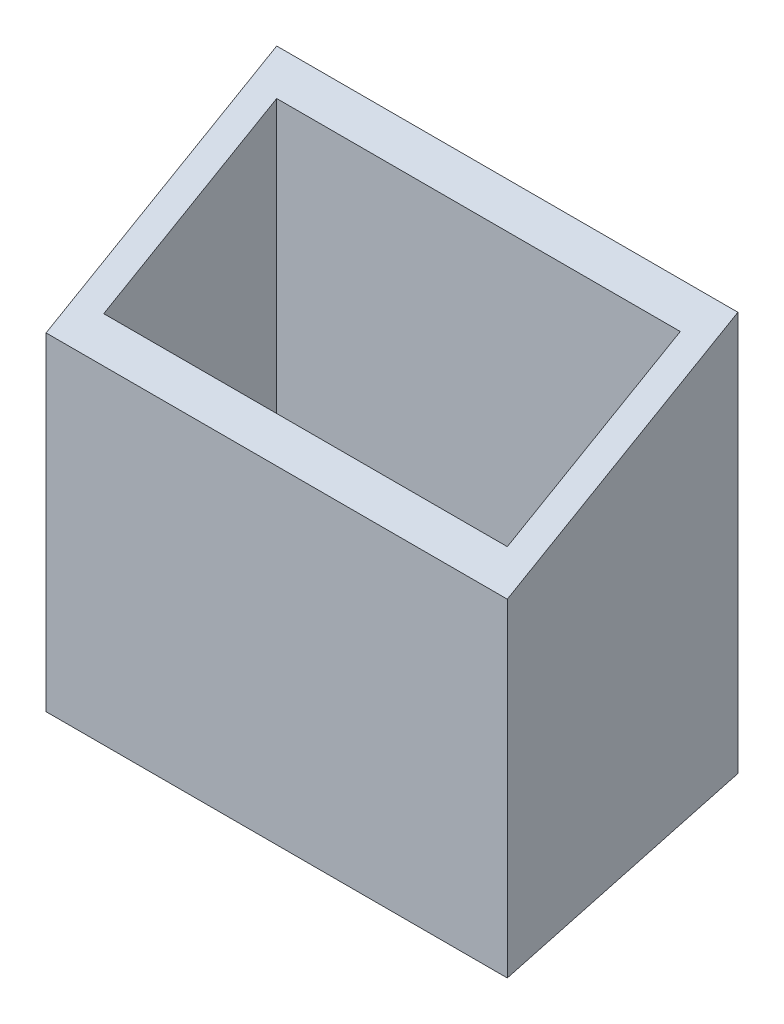
ISO-10303-21;
HEADER;
FILE_DESCRIPTION(('STEP AP214'),'2;1');
FILE_NAME('part.step','',(''),(''),'','','');
FILE_SCHEMA(('AUTOMOTIVE_DESIGN { 1 0 10303 214 1 1 1 1 }'));
ENDSEC;
DATA;
#1=APPLICATION_CONTEXT('core data for automotive mechanical design processes');
#2=APPLICATION_PROTOCOL_DEFINITION('international standard','automotive_design',2000,#1);
#3=PRODUCT_CONTEXT('',#1,'mechanical');
#4=PRODUCT('Part','Part','',(#3));
#5=PRODUCT_RELATED_PRODUCT_CATEGORY('part','',(#4));
#6=PRODUCT_DEFINITION_FORMATION('','',#4);
#7=PRODUCT_DEFINITION_CONTEXT('part definition',#1,'design');
#8=PRODUCT_DEFINITION('design','',#6,#7);
#9=PRODUCT_DEFINITION_SHAPE('','',#8);
#10=(LENGTH_UNIT() NAMED_UNIT(*) SI_UNIT(.MILLI.,.METRE.));
#11=(NAMED_UNIT(*) PLANE_ANGLE_UNIT() SI_UNIT($,.RADIAN.));
#12=(NAMED_UNIT(*) SI_UNIT($,.STERADIAN.) SOLID_ANGLE_UNIT());
#13=UNCERTAINTY_MEASURE_WITH_UNIT(LENGTH_MEASURE(1.E-05),#10,'distance_accuracy_value','');
#14=(GEOMETRIC_REPRESENTATION_CONTEXT(3) GLOBAL_UNCERTAINTY_ASSIGNED_CONTEXT((#13)) GLOBAL_UNIT_ASSIGNED_CONTEXT((#10,
#11,#12)) REPRESENTATION_CONTEXT('',''));
#15=CARTESIAN_POINT('',(0.,0.,0.));
#16=DIRECTION('',(0.,0.,1.));
#17=DIRECTION('',(1.,0.,0.));
#18=AXIS2_PLACEMENT_3D('',#15,#16,#17);
#19=CARTESIAN_POINT('',(25.4,50.8,-12.7));
#20=DIRECTION('',(-1.,0.,0.));
#21=DIRECTION('',(0.,0.,1.));
#22=AXIS2_PLACEMENT_3D('',#19,#20,#21);
#23=PLANE('',#22);
#24=DIRECTION('',(0.,0.258819045102522,-0.965925826289068));
#25=VECTOR('',#24,1.);
#26=CARTESIAN_POINT('',(25.4,3.17500000000001,0.850738685968815));
#27=LINE('',#26,#25);
#28=CARTESIAN_POINT('',(25.4,0.,12.7));
#29=VERTEX_POINT('',#28);
#30=CARTESIAN_POINT('',(25.4,6.80590948775054,-12.7));
#31=VERTEX_POINT('',#30);
#32=EDGE_CURVE('E116',#29,#31,#27,.T.);
#33=ORIENTED_EDGE('',*,*,#32,.T.);
#34=DIRECTION('',(0.,-1.,0.));
#35=VECTOR('',#34,1.);
#36=CARTESIAN_POINT('',(25.4,50.8,-12.7));
#37=LINE('',#36,#35);
#38=CARTESIAN_POINT('',(25.4,50.8,-12.7));
#39=VERTEX_POINT('',#38);
#40=EDGE_CURVE('E138',#39,#31,#37,.T.);
#41=ORIENTED_EDGE('',*,*,#40,.F.);
#42=DIRECTION('',(0.,-0.499999999999995,0.866025403784442));
#43=VECTOR('',#42,1.);
#44=CARTESIAN_POINT('',(25.4,32.6007386859691,18.8220452561247));
#45=LINE('',#44,#43);
#46=CARTESIAN_POINT('',(25.4,36.1353031625837,12.7));
#47=VERTEX_POINT('',#46);
#48=EDGE_CURVE('E183',#39,#47,#45,.T.);
#49=ORIENTED_EDGE('',*,*,#48,.T.);
#50=DIRECTION('',(0.,-1.,0.));
#51=VECTOR('',#50,1.);
#52=CARTESIAN_POINT('',(25.4,50.8,12.7));
#53=LINE('',#52,#51);
#54=EDGE_CURVE('E136',#47,#29,#53,.T.);
#55=ORIENTED_EDGE('',*,*,#54,.T.);
#56=EDGE_LOOP('',(#33,#41,#49,#55));
#57=FACE_BOUND('',#56,.T.);
#58=ADVANCED_FACE('F39',(#57),#23,.F.);
#59=CARTESIAN_POINT('',(-25.4,50.8,-12.7));
#60=DIRECTION('',(0.,0.,1.));
#61=DIRECTION('',(1.,0.,0.));
#62=AXIS2_PLACEMENT_3D('',#59,#60,#61);
#63=PLANE('',#62);
#64=DIRECTION('',(1.,0.,0.));
#65=VECTOR('',#64,1.);
#66=CARTESIAN_POINT('',(-25.4,6.80590948775054,-12.7));
#67=LINE('',#66,#65);
#68=CARTESIAN_POINT('',(-25.4,6.80590948775054,-12.7));
#69=VERTEX_POINT('',#68);
#70=EDGE_CURVE('E132',#69,#31,#67,.T.);
#71=ORIENTED_EDGE('',*,*,#70,.F.);
#72=DIRECTION('',(0.,-1.,0.));
#73=VECTOR('',#72,1.);
#74=CARTESIAN_POINT('',(-25.4,50.8,-12.7));
#75=LINE('',#74,#73);
#76=CARTESIAN_POINT('',(-25.4,50.8,-12.7));
#77=VERTEX_POINT('',#76);
#78=EDGE_CURVE('E131',#77,#69,#75,.T.);
#79=ORIENTED_EDGE('',*,*,#78,.F.);
#80=DIRECTION('',(-1.,0.,0.));
#81=VECTOR('',#80,1.);
#82=CARTESIAN_POINT('',(-25.4,50.8,-12.7));
#83=LINE('',#82,#81);
#84=EDGE_CURVE('E122',#39,#77,#83,.T.);
#85=ORIENTED_EDGE('',*,*,#84,.F.);
#86=ORIENTED_EDGE('',*,*,#40,.T.);
#87=EDGE_LOOP('',(#71,#79,#85,#86));
#88=FACE_BOUND('',#87,.T.);
#89=ADVANCED_FACE('F188',(#88),#63,.F.);
#90=CARTESIAN_POINT('',(-25.4,50.8,-12.7));
#91=DIRECTION('',(1.,0.,0.));
#92=DIRECTION('',(0.,0.,-1.));
#93=AXIS2_PLACEMENT_3D('',#90,#91,#92);
#94=PLANE('',#93);
#95=DIRECTION('',(0.,0.258819045102522,-0.965925826289068));
#96=VECTOR('',#95,1.);
#97=CARTESIAN_POINT('',(-25.4,3.17500000000001,0.850738685968829));
#98=LINE('',#97,#96);
#99=CARTESIAN_POINT('',(-25.4,0.,12.7));
#100=VERTEX_POINT('',#99);
#101=EDGE_CURVE('E113',#100,#69,#98,.T.);
#102=ORIENTED_EDGE('',*,*,#101,.F.);
#103=DIRECTION('',(0.,-1.,0.));
#104=VECTOR('',#103,1.);
#105=CARTESIAN_POINT('',(-25.4,50.8,12.7));
#106=LINE('',#105,#104);
#107=CARTESIAN_POINT('',(-25.4,36.1353031625837,12.7));
#108=VERTEX_POINT('',#107);
#109=EDGE_CURVE('E129',#108,#100,#106,.T.);
#110=ORIENTED_EDGE('',*,*,#109,.F.);
#111=DIRECTION('',(0.,-0.499999999999995,0.866025403784442));
#112=VECTOR('',#111,1.);
#113=CARTESIAN_POINT('',(-25.4,32.6007386859691,18.8220452561247));
#114=LINE('',#113,#112);
#115=EDGE_CURVE('E64',#77,#108,#114,.T.);
#116=ORIENTED_EDGE('',*,*,#115,.F.);
#117=ORIENTED_EDGE('',*,*,#78,.T.);
#118=EDGE_LOOP('',(#102,#110,#116,#117));
#119=FACE_BOUND('',#118,.T.);
#120=ADVANCED_FACE('F128',(#119),#94,.F.);
#121=CARTESIAN_POINT('',(-22.225,50.8,-9.525));
#122=DIRECTION('',(1.,0.,0.));
#123=DIRECTION('',(0.,0.,-1.));
#124=AXIS2_PLACEMENT_3D('',#121,#122,#123);
#125=PLANE('',#124);
#126=DIRECTION('',(0.,-1.,0.));
#127=VECTOR('',#126,1.);
#128=CARTESIAN_POINT('',(-22.225,50.8,9.525));
#129=LINE('',#128,#127);
#130=CARTESIAN_POINT('',(-22.225,37.9683902672608,9.525));
#131=VERTEX_POINT('',#130);
#132=CARTESIAN_POINT('',(-22.225,0.85073868596882,9.525));
#133=VERTEX_POINT('',#132);
#134=EDGE_CURVE('E123',#131,#133,#129,.T.);
#135=ORIENTED_EDGE('',*,*,#134,.T.);
#136=DIRECTION('',(0.,0.258819045102522,-0.965925826289068));
#137=VECTOR('',#136,1.);
#138=CARTESIAN_POINT('',(-22.225,8.9592047438753,-20.7362072995546));
#139=LINE('',#138,#137);
#140=CARTESIAN_POINT('',(-22.225,5.95517080178173,-9.525));
#141=VERTEX_POINT('',#140);
#142=EDGE_CURVE('E186',#133,#141,#139,.T.);
#143=ORIENTED_EDGE('',*,*,#142,.T.);
#144=DIRECTION('',(0.,-1.,0.));
#145=VECTOR('',#144,1.);
#146=CARTESIAN_POINT('',(-22.225,50.8,-9.525));
#147=LINE('',#146,#145);
#148=CARTESIAN_POINT('',(-22.225,48.966912895323,-9.525));
#149=VERTEX_POINT('',#148);
#150=EDGE_CURVE('E171',#149,#141,#147,.T.);
#151=ORIENTED_EDGE('',*,*,#150,.F.);
#152=DIRECTION('',(0.,0.499999999999995,-0.866025403784442));
#153=VECTOR('',#152,1.);
#154=CARTESIAN_POINT('',(-22.225,49.4251846714922,-10.31875));
#155=LINE('',#154,#153);
#156=EDGE_CURVE('E155',#131,#149,#155,.T.);
#157=ORIENTED_EDGE('',*,*,#156,.F.);
#158=EDGE_LOOP('',(#135,#143,#151,#157));
#159=FACE_BOUND('',#158,.T.);
#160=ADVANCED_FACE('F209',(#159),#125,.T.);
#161=CARTESIAN_POINT('',(-22.225,50.8,9.525));
#162=DIRECTION('',(0.,0.,-1.));
#163=DIRECTION('',(-1.,0.,0.));
#164=AXIS2_PLACEMENT_3D('',#161,#162,#163);
#165=PLANE('',#164);
#166=DIRECTION('',(0.,-1.,0.));
#167=VECTOR('',#166,1.);
#168=CARTESIAN_POINT('',(22.225,50.8,9.525));
#169=LINE('',#168,#167);
#170=CARTESIAN_POINT('',(22.225,37.9683902672608,9.525));
#171=VERTEX_POINT('',#170);
#172=CARTESIAN_POINT('',(22.225,0.85073868596882,9.525));
#173=VERTEX_POINT('',#172);
#174=EDGE_CURVE('E166',#171,#173,#169,.T.);
#175=ORIENTED_EDGE('',*,*,#174,.T.);
#176=DIRECTION('',(-1.,0.,0.));
#177=VECTOR('',#176,1.);
#178=CARTESIAN_POINT('',(-22.225,0.85073868596882,9.525));
#179=LINE('',#178,#177);
#180=EDGE_CURVE('E193',#173,#133,#179,.T.);
#181=ORIENTED_EDGE('',*,*,#180,.T.);
#182=ORIENTED_EDGE('',*,*,#134,.F.);
#183=DIRECTION('',(-1.,0.,0.));
#184=VECTOR('',#183,1.);
#185=CARTESIAN_POINT('',(-22.225,37.9683902672608,9.525));
#186=LINE('',#185,#184);
#187=EDGE_CURVE('E167',#171,#131,#186,.T.);
#188=ORIENTED_EDGE('',*,*,#187,.F.);
#189=EDGE_LOOP('',(#175,#181,#182,#188));
#190=FACE_BOUND('',#189,.T.);
#191=ADVANCED_FACE('F210',(#190),#165,.T.);
#192=CARTESIAN_POINT('',(22.225,50.8,-9.525));
#193=DIRECTION('',(-1.,0.,0.));
#194=DIRECTION('',(0.,0.,1.));
#195=AXIS2_PLACEMENT_3D('',#192,#193,#194);
#196=PLANE('',#195);
#197=DIRECTION('',(0.,-1.,0.));
#198=VECTOR('',#197,1.);
#199=CARTESIAN_POINT('',(22.225,50.8,-9.525));
#200=LINE('',#199,#198);
#201=CARTESIAN_POINT('',(22.225,48.966912895323,-9.525));
#202=VERTEX_POINT('',#201);
#203=CARTESIAN_POINT('',(22.225,5.95517080178173,-9.525));
#204=VERTEX_POINT('',#203);
#205=EDGE_CURVE('E164',#202,#204,#200,.T.);
#206=ORIENTED_EDGE('',*,*,#205,.T.);
#207=DIRECTION('',(0.,-0.258819045102522,0.965925826289068));
#208=VECTOR('',#207,1.);
#209=CARTESIAN_POINT('',(22.225,8.9592047438753,-20.7362072995546));
#210=LINE('',#209,#208);
#211=EDGE_CURVE('E57',#204,#173,#210,.T.);
#212=ORIENTED_EDGE('',*,*,#211,.T.);
#213=ORIENTED_EDGE('',*,*,#174,.F.);
#214=DIRECTION('',(0.,-0.499999999999995,0.866025403784442));
#215=VECTOR('',#214,1.);
#216=CARTESIAN_POINT('',(22.225,49.4251846714922,-10.31875));
#217=LINE('',#216,#215);
#218=EDGE_CURVE('E152',#202,#171,#217,.T.);
#219=ORIENTED_EDGE('',*,*,#218,.F.);
#220=EDGE_LOOP('',(#206,#212,#213,#219));
#221=FACE_BOUND('',#220,.T.);
#222=ADVANCED_FACE('F163',(#221),#196,.T.);
#223=CARTESIAN_POINT('',(-22.225,50.8,-9.525));
#224=DIRECTION('',(0.,0.,1.));
#225=DIRECTION('',(1.,0.,0.));
#226=AXIS2_PLACEMENT_3D('',#223,#224,#225);
#227=PLANE('',#226);
#228=ORIENTED_EDGE('',*,*,#150,.T.);
#229=DIRECTION('',(1.,0.,0.));
#230=VECTOR('',#229,1.);
#231=CARTESIAN_POINT('',(-22.225,5.95517080178173,-9.525));
#232=LINE('',#231,#230);
#233=EDGE_CURVE('E11',#141,#204,#232,.T.);
#234=ORIENTED_EDGE('',*,*,#233,.T.);
#235=ORIENTED_EDGE('',*,*,#205,.F.);
#236=DIRECTION('',(1.,0.,0.));
#237=VECTOR('',#236,1.);
#238=CARTESIAN_POINT('',(-22.225,48.966912895323,-9.525));
#239=LINE('',#238,#237);
#240=EDGE_CURVE('E47',#149,#202,#239,.T.);
#241=ORIENTED_EDGE('',*,*,#240,.F.);
#242=EDGE_LOOP('',(#228,#234,#235,#241));
#243=FACE_BOUND('',#242,.T.);
#244=ADVANCED_FACE('F169',(#243),#227,.T.);
#245=CARTESIAN_POINT('',(-25.4,50.8,12.7));
#246=DIRECTION('',(0.,0.,-1.));
#247=DIRECTION('',(-1.,0.,0.));
#248=AXIS2_PLACEMENT_3D('',#245,#246,#247);
#249=PLANE('',#248);
#250=ORIENTED_EDGE('',*,*,#54,.F.);
#251=DIRECTION('',(-1.,0.,0.));
#252=VECTOR('',#251,1.);
#253=CARTESIAN_POINT('',(25.4,36.1353031625837,12.7));
#254=LINE('',#253,#252);
#255=EDGE_CURVE('E135',#47,#108,#254,.T.);
#256=ORIENTED_EDGE('',*,*,#255,.T.);
#257=ORIENTED_EDGE('',*,*,#109,.T.);
#258=DIRECTION('',(1.,0.,0.));
#259=VECTOR('',#258,1.);
#260=CARTESIAN_POINT('',(-25.4,0.,12.7));
#261=LINE('',#260,#259);
#262=EDGE_CURVE('E110',#100,#29,#261,.T.);
#263=ORIENTED_EDGE('',*,*,#262,.T.);
#264=EDGE_LOOP('',(#250,#256,#257,#263));
#265=FACE_BOUND('',#264,.T.);
#266=ADVANCED_FACE('F134',(#265),#249,.F.);
#267=CARTESIAN_POINT('',(25.4,32.6007386859691,18.8220452561247));
#268=DIRECTION('',(0.,-0.866025403784442,-0.499999999999995));
#269=DIRECTION('',(0.,0.499999999999995,-0.866025403784442));
#270=AXIS2_PLACEMENT_3D('',#267,#268,#269);
#271=PLANE('',#270);
#272=ORIENTED_EDGE('',*,*,#156,.T.);
#273=ORIENTED_EDGE('',*,*,#240,.T.);
#274=ORIENTED_EDGE('',*,*,#218,.T.);
#275=ORIENTED_EDGE('',*,*,#187,.T.);
#276=EDGE_LOOP('',(#272,#273,#274,#275));
#277=FACE_BOUND('',#276,.T.);
#278=ORIENTED_EDGE('',*,*,#115,.T.);
#279=ORIENTED_EDGE('',*,*,#255,.F.);
#280=ORIENTED_EDGE('',*,*,#48,.F.);
#281=ORIENTED_EDGE('',*,*,#84,.T.);
#282=EDGE_LOOP('',(#278,#279,#280,#281));
#283=FACE_BOUND('',#282,.T.);
#284=ADVANCED_FACE('F151',(#277,#283),#271,.F.);
#285=CARTESIAN_POINT('',(-25.4,3.17500000000001,0.850738685968829));
#286=DIRECTION('',(0.,-0.965925826289068,-0.258819045102522));
#287=DIRECTION('',(0.,0.258819045102522,-0.965925826289068));
#288=AXIS2_PLACEMENT_3D('',#285,#286,#287);
#289=PLANE('',#288);
#290=ORIENTED_EDGE('',*,*,#180,.F.);
#291=ORIENTED_EDGE('',*,*,#211,.F.);
#292=ORIENTED_EDGE('',*,*,#233,.F.);
#293=ORIENTED_EDGE('',*,*,#142,.F.);
#294=EDGE_LOOP('',(#290,#291,#292,#293));
#295=FACE_BOUND('',#294,.T.);
#296=ORIENTED_EDGE('',*,*,#32,.F.);
#297=ORIENTED_EDGE('',*,*,#262,.F.);
#298=ORIENTED_EDGE('',*,*,#101,.T.);
#299=ORIENTED_EDGE('',*,*,#70,.T.);
#300=EDGE_LOOP('',(#296,#297,#298,#299));
#301=FACE_BOUND('',#300,.T.);
#302=ADVANCED_FACE('F112',(#295,#301),#289,.T.);
#303=CLOSED_SHELL('',(#58,#89,#120,#160,#191,#222,#244,#266,#284,#302));
#304=MANIFOLD_SOLID_BREP('B2',#303);
#305=ADVANCED_BREP_SHAPE_REPRESENTATION('',(#18,#304),#14);
#306=SHAPE_DEFINITION_REPRESENTATION(#9,#305);
ENDSEC;
END-ISO-10303-21;
